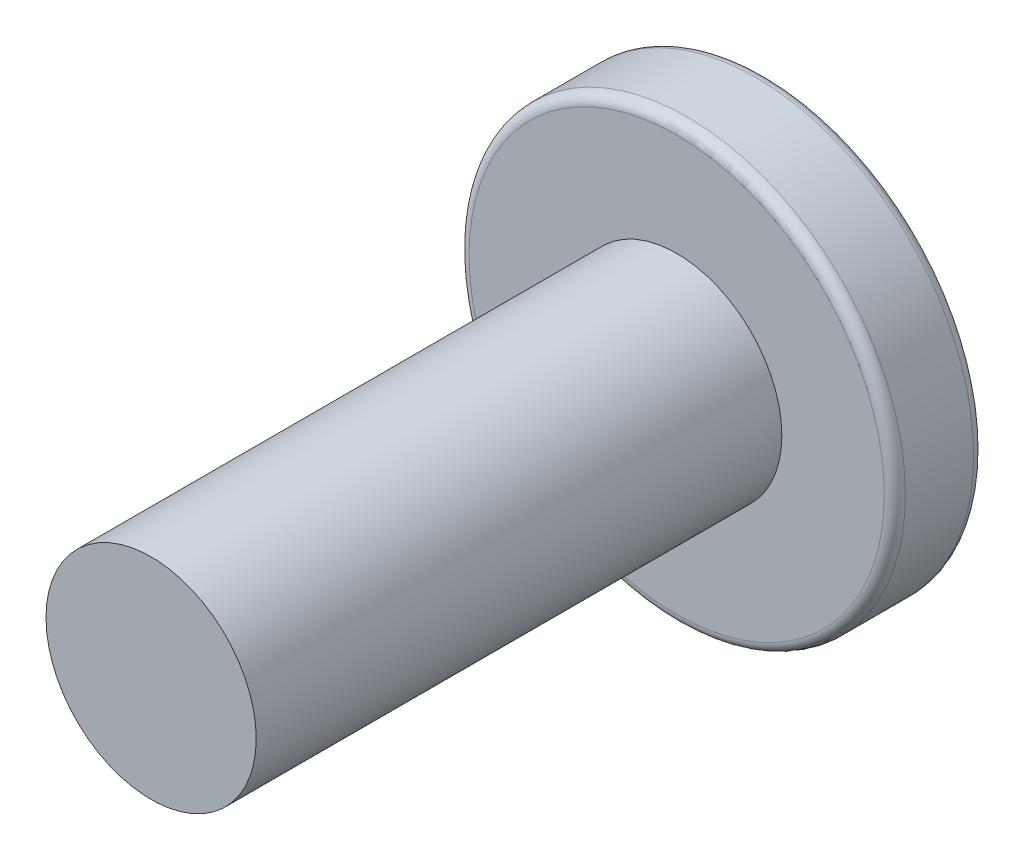
ISO-10303-21;
HEADER;
FILE_DESCRIPTION(('STEP AP214'),'2;1');
FILE_NAME('part.step','',(''),(''),'','','');
FILE_SCHEMA(('AUTOMOTIVE_DESIGN { 1 0 10303 214 1 1 1 1 }'));
ENDSEC;
DATA;
#1=APPLICATION_CONTEXT('core data for automotive mechanical design processes');
#2=APPLICATION_PROTOCOL_DEFINITION('international standard','automotive_design',2000,#1);
#3=PRODUCT_CONTEXT('',#1,'mechanical');
#4=PRODUCT('Part','Part','',(#3));
#5=PRODUCT_RELATED_PRODUCT_CATEGORY('part','',(#4));
#6=PRODUCT_DEFINITION_FORMATION('','',#4);
#7=PRODUCT_DEFINITION_CONTEXT('part definition',#1,'design');
#8=PRODUCT_DEFINITION('design','',#6,#7);
#9=PRODUCT_DEFINITION_SHAPE('','',#8);
#10=(LENGTH_UNIT() NAMED_UNIT(*) SI_UNIT(.MILLI.,.METRE.));
#11=(NAMED_UNIT(*) PLANE_ANGLE_UNIT() SI_UNIT($,.RADIAN.));
#12=(NAMED_UNIT(*) SI_UNIT($,.STERADIAN.) SOLID_ANGLE_UNIT());
#13=UNCERTAINTY_MEASURE_WITH_UNIT(LENGTH_MEASURE(1.E-05),#10,'distance_accuracy_value','');
#14=(GEOMETRIC_REPRESENTATION_CONTEXT(3) GLOBAL_UNCERTAINTY_ASSIGNED_CONTEXT((#13)) GLOBAL_UNIT_ASSIGNED_CONTEXT((#10,
#11,#12)) REPRESENTATION_CONTEXT('',''));
#15=CARTESIAN_POINT('',(0.,0.,0.));
#16=DIRECTION('',(0.,0.,1.));
#17=DIRECTION('',(1.,0.,0.));
#18=AXIS2_PLACEMENT_3D('',#15,#16,#17);
#19=CARTESIAN_POINT('',(0.,0.,1.7));
#20=DIRECTION('',(0.,0.,-1.));
#21=DIRECTION('',(-1.,0.,0.));
#22=AXIS2_PLACEMENT_3D('',#19,#20,#21);
#23=CYLINDRICAL_SURFACE('',#22,4.15);
#24=CARTESIAN_POINT('',(0.,0.,0.2));
#25=DIRECTION('',(0.,0.,1.));
#26=DIRECTION('',(1.,0.,0.));
#27=AXIS2_PLACEMENT_3D('',#24,#25,#26);
#28=CIRCLE('',#27,4.15);
#29=CARTESIAN_POINT('',(4.15,0.,0.2));
#30=VERTEX_POINT('',#29);
#31=EDGE_CURVE('E179',#30,#30,#28,.T.);
#32=ORIENTED_EDGE('',*,*,#31,.T.);
#33=EDGE_LOOP('',(#32));
#34=FACE_BOUND('',#33,.T.);
#35=CARTESIAN_POINT('',(0.,0.,1.5));
#36=DIRECTION('',(0.,0.,1.));
#37=DIRECTION('',(1.,0.,0.));
#38=AXIS2_PLACEMENT_3D('',#35,#36,#37);
#39=CIRCLE('',#38,4.15);
#40=CARTESIAN_POINT('',(4.15,0.,1.5));
#41=VERTEX_POINT('',#40);
#42=EDGE_CURVE('E175',#41,#41,#39,.F.);
#43=ORIENTED_EDGE('',*,*,#42,.T.);
#44=EDGE_LOOP('',(#43));
#45=FACE_BOUND('',#44,.T.);
#46=ADVANCED_FACE('F43',(#34,#45),#23,.T.);
#47=CARTESIAN_POINT('',(0.,0.,1.7));
#48=DIRECTION('',(0.,0.,1.));
#49=DIRECTION('',(1.,0.,0.));
#50=AXIS2_PLACEMENT_3D('',#47,#48,#49);
#51=PLANE('',#50);
#52=CARTESIAN_POINT('',(0.,0.,1.7));
#53=DIRECTION('',(0.,0.,1.));
#54=DIRECTION('',(1.,0.,0.));
#55=AXIS2_PLACEMENT_3D('',#52,#53,#54);
#56=CIRCLE('',#55,3.95);
#57=CARTESIAN_POINT('',(3.95,0.,1.7));
#58=VERTEX_POINT('',#57);
#59=EDGE_CURVE('E11',#58,#58,#56,.T.);
#60=ORIENTED_EDGE('',*,*,#59,.T.);
#61=EDGE_LOOP('',(#60));
#62=FACE_BOUND('',#61,.T.);
#63=CARTESIAN_POINT('',(0.,0.,1.7));
#64=DIRECTION('',(0.,0.,1.));
#65=DIRECTION('',(1.,0.,0.));
#66=AXIS2_PLACEMENT_3D('',#63,#64,#65);
#67=CIRCLE('',#66,2.);
#68=CARTESIAN_POINT('',(2.,0.,1.7));
#69=VERTEX_POINT('',#68);
#70=EDGE_CURVE('E171',#69,#69,#67,.T.);
#71=ORIENTED_EDGE('',*,*,#70,.F.);
#72=EDGE_LOOP('',(#71));
#73=FACE_BOUND('',#72,.T.);
#74=ADVANCED_FACE('F196',(#62,#73),#51,.T.);
#75=CARTESIAN_POINT('',(0.,0.,0.));
#76=DIRECTION('',(0.,0.,1.));
#77=DIRECTION('',(1.,0.,0.));
#78=AXIS2_PLACEMENT_3D('',#75,#76,#77);
#79=PLANE('',#78);
#80=DIRECTION('',(0.5,0.866025403784438,0.));
#81=VECTOR('',#80,1.);
#82=CARTESIAN_POINT('',(-1.15470053837925,0.,0.));
#83=LINE('',#82,#81);
#84=CARTESIAN_POINT('',(-1.15470053837925,0.,0.));
#85=VERTEX_POINT('',#84);
#86=CARTESIAN_POINT('',(-0.577350269189626,1.,0.));
#87=VERTEX_POINT('',#86);
#88=EDGE_CURVE('E139',#85,#87,#83,.T.);
#89=ORIENTED_EDGE('',*,*,#88,.F.);
#90=DIRECTION('',(-0.5,0.866025403784439,0.));
#91=VECTOR('',#90,1.);
#92=CARTESIAN_POINT('',(-0.577350269189626,-1.,0.));
#93=LINE('',#92,#91);
#94=CARTESIAN_POINT('',(-0.577350269189626,-1.,0.));
#95=VERTEX_POINT('',#94);
#96=EDGE_CURVE('E59',#95,#85,#93,.T.);
#97=ORIENTED_EDGE('',*,*,#96,.F.);
#98=DIRECTION('',(-1.,0.,0.));
#99=VECTOR('',#98,1.);
#100=CARTESIAN_POINT('',(0.577350269189626,-1.,0.));
#101=LINE('',#100,#99);
#102=CARTESIAN_POINT('',(0.577350269189626,-1.,0.));
#103=VERTEX_POINT('',#102);
#104=EDGE_CURVE('E152',#103,#95,#101,.T.);
#105=ORIENTED_EDGE('',*,*,#104,.F.);
#106=DIRECTION('',(-0.5,-0.866025403784438,0.));
#107=VECTOR('',#106,1.);
#108=CARTESIAN_POINT('',(1.15470053837925,0.,0.));
#109=LINE('',#108,#107);
#110=CARTESIAN_POINT('',(1.15470053837925,0.,0.));
#111=VERTEX_POINT('',#110);
#112=EDGE_CURVE('E149',#111,#103,#109,.T.);
#113=ORIENTED_EDGE('',*,*,#112,.F.);
#114=DIRECTION('',(0.5,-0.866025403784439,0.));
#115=VECTOR('',#114,1.);
#116=CARTESIAN_POINT('',(0.577350269189626,1.,0.));
#117=LINE('',#116,#115);
#118=CARTESIAN_POINT('',(0.577350269189626,1.,0.));
#119=VERTEX_POINT('',#118);
#120=EDGE_CURVE('E107',#119,#111,#117,.T.);
#121=ORIENTED_EDGE('',*,*,#120,.F.);
#122=DIRECTION('',(1.,0.,0.));
#123=VECTOR('',#122,1.);
#124=CARTESIAN_POINT('',(-0.577350269189626,1.,0.));
#125=LINE('',#124,#123);
#126=EDGE_CURVE('E143',#87,#119,#125,.T.);
#127=ORIENTED_EDGE('',*,*,#126,.F.);
#128=EDGE_LOOP('',(#89,#97,#105,#113,#121,#127));
#129=FACE_BOUND('',#128,.T.);
#130=CARTESIAN_POINT('',(0.,0.,0.));
#131=DIRECTION('',(0.,0.,1.));
#132=DIRECTION('',(1.,0.,0.));
#133=AXIS2_PLACEMENT_3D('',#130,#131,#132);
#134=CIRCLE('',#133,3.95);
#135=CARTESIAN_POINT('',(3.95,0.,0.));
#136=VERTEX_POINT('',#135);
#137=EDGE_CURVE('E52',#136,#136,#134,.F.);
#138=ORIENTED_EDGE('',*,*,#137,.T.);
#139=EDGE_LOOP('',(#138));
#140=FACE_BOUND('',#139,.T.);
#141=ADVANCED_FACE('F186',(#129,#140),#79,.F.);
#142=CARTESIAN_POINT('',(0.,0.,11.7));
#143=DIRECTION('',(0.,0.,-1.));
#144=DIRECTION('',(-1.,0.,0.));
#145=AXIS2_PLACEMENT_3D('',#142,#143,#144);
#146=CYLINDRICAL_SURFACE('',#145,2.);
#147=CARTESIAN_POINT('',(0.,0.,11.7));
#148=DIRECTION('',(0.,0.,1.));
#149=DIRECTION('',(1.,0.,0.));
#150=AXIS2_PLACEMENT_3D('',#147,#148,#149);
#151=CIRCLE('',#150,2.);
#152=CARTESIAN_POINT('',(2.,0.,11.7));
#153=VERTEX_POINT('',#152);
#154=EDGE_CURVE('E158',#153,#153,#151,.T.);
#155=ORIENTED_EDGE('',*,*,#154,.F.);
#156=EDGE_LOOP('',(#155));
#157=FACE_BOUND('',#156,.T.);
#158=ORIENTED_EDGE('',*,*,#70,.T.);
#159=EDGE_LOOP('',(#158));
#160=FACE_BOUND('',#159,.T.);
#161=ADVANCED_FACE('F210',(#157,#160),#146,.T.);
#162=CARTESIAN_POINT('',(0.,0.,11.7));
#163=DIRECTION('',(0.,0.,1.));
#164=DIRECTION('',(1.,0.,0.));
#165=AXIS2_PLACEMENT_3D('',#162,#163,#164);
#166=PLANE('',#165);
#167=ORIENTED_EDGE('',*,*,#154,.T.);
#168=EDGE_LOOP('',(#167));
#169=FACE_BOUND('',#168,.T.);
#170=ADVANCED_FACE('F191',(#169),#166,.T.);
#171=CARTESIAN_POINT('',(0.,0.,0.2));
#172=DIRECTION('',(0.,0.,1.));
#173=DIRECTION('',(1.,0.,0.));
#174=AXIS2_PLACEMENT_3D('',#171,#172,#173);
#175=TOROIDAL_SURFACE('',#174,3.95,0.2);
#176=ORIENTED_EDGE('',*,*,#137,.F.);
#177=EDGE_LOOP('',(#176));
#178=FACE_BOUND('',#177,.T.);
#179=ORIENTED_EDGE('',*,*,#31,.F.);
#180=EDGE_LOOP('',(#179));
#181=FACE_BOUND('',#180,.T.);
#182=ADVANCED_FACE('F188',(#178,#181),#175,.T.);
#183=CARTESIAN_POINT('',(0.,0.,1.5));
#184=DIRECTION('',(0.,0.,1.));
#185=DIRECTION('',(1.,0.,0.));
#186=AXIS2_PLACEMENT_3D('',#183,#184,#185);
#187=TOROIDAL_SURFACE('',#186,3.95,0.2);
#188=ORIENTED_EDGE('',*,*,#42,.F.);
#189=EDGE_LOOP('',(#188));
#190=FACE_BOUND('',#189,.T.);
#191=ORIENTED_EDGE('',*,*,#59,.F.);
#192=EDGE_LOOP('',(#191));
#193=FACE_BOUND('',#192,.T.);
#194=ADVANCED_FACE('F45',(#190,#193),#187,.T.);
#195=CARTESIAN_POINT('',(-0.577350269189626,-1.,1.5));
#196=DIRECTION('',(-0.866025403784439,-0.5,0.));
#197=DIRECTION('',(0.5,-0.866025403784439,0.));
#198=AXIS2_PLACEMENT_3D('',#195,#196,#197);
#199=PLANE('',#198);
#200=ORIENTED_EDGE('',*,*,#96,.T.);
#201=DIRECTION('',(0.,0.,-1.));
#202=VECTOR('',#201,1.);
#203=CARTESIAN_POINT('',(-1.15470053837925,0.,1.5));
#204=LINE('',#203,#202);
#205=CARTESIAN_POINT('',(-1.15470053837925,0.,1.5));
#206=VERTEX_POINT('',#205);
#207=EDGE_CURVE('E89',#206,#85,#204,.T.);
#208=ORIENTED_EDGE('',*,*,#207,.F.);
#209=DIRECTION('',(-0.5,0.866025403784439,0.));
#210=VECTOR('',#209,1.);
#211=CARTESIAN_POINT('',(-0.577350269189626,-1.,1.5));
#212=LINE('',#211,#210);
#213=CARTESIAN_POINT('',(-0.577350269189626,-1.,1.5));
#214=VERTEX_POINT('',#213);
#215=EDGE_CURVE('E155',#214,#206,#212,.T.);
#216=ORIENTED_EDGE('',*,*,#215,.F.);
#217=DIRECTION('',(0.,0.,-1.));
#218=VECTOR('',#217,1.);
#219=CARTESIAN_POINT('',(-0.577350269189626,-1.,1.5));
#220=LINE('',#219,#218);
#221=EDGE_CURVE('E67',#214,#95,#220,.T.);
#222=ORIENTED_EDGE('',*,*,#221,.T.);
#223=EDGE_LOOP('',(#200,#208,#216,#222));
#224=FACE_BOUND('',#223,.T.);
#225=ADVANCED_FACE('F202',(#224),#199,.F.);
#226=CARTESIAN_POINT('',(0.577350269189626,-1.,1.5));
#227=DIRECTION('',(0.,-1.,0.));
#228=DIRECTION('',(0.,0.,-1.));
#229=AXIS2_PLACEMENT_3D('',#226,#227,#228);
#230=PLANE('',#229);
#231=ORIENTED_EDGE('',*,*,#104,.T.);
#232=ORIENTED_EDGE('',*,*,#221,.F.);
#233=DIRECTION('',(-1.,0.,0.));
#234=VECTOR('',#233,1.);
#235=CARTESIAN_POINT('',(0.577350269189626,-1.,1.5));
#236=LINE('',#235,#234);
#237=CARTESIAN_POINT('',(0.577350269189626,-1.,1.5));
#238=VERTEX_POINT('',#237);
#239=EDGE_CURVE('E121',#238,#214,#236,.T.);
#240=ORIENTED_EDGE('',*,*,#239,.F.);
#241=DIRECTION('',(0.,0.,-1.));
#242=VECTOR('',#241,1.);
#243=CARTESIAN_POINT('',(0.577350269189626,-1.,1.5));
#244=LINE('',#243,#242);
#245=EDGE_CURVE('E112',#238,#103,#244,.T.);
#246=ORIENTED_EDGE('',*,*,#245,.T.);
#247=EDGE_LOOP('',(#231,#232,#240,#246));
#248=FACE_BOUND('',#247,.T.);
#249=ADVANCED_FACE('F226',(#248),#230,.F.);
#250=CARTESIAN_POINT('',(1.15470053837925,0.,1.5));
#251=DIRECTION('',(0.866025403784439,-0.5,0.));
#252=DIRECTION('',(0.5,0.866025403784439,0.));
#253=AXIS2_PLACEMENT_3D('',#250,#251,#252);
#254=PLANE('',#253);
#255=ORIENTED_EDGE('',*,*,#112,.T.);
#256=ORIENTED_EDGE('',*,*,#245,.F.);
#257=DIRECTION('',(-0.5,-0.866025403784438,0.));
#258=VECTOR('',#257,1.);
#259=CARTESIAN_POINT('',(1.15470053837925,0.,1.5));
#260=LINE('',#259,#258);
#261=CARTESIAN_POINT('',(1.15470053837925,0.,1.5));
#262=VERTEX_POINT('',#261);
#263=EDGE_CURVE('E116',#262,#238,#260,.T.);
#264=ORIENTED_EDGE('',*,*,#263,.F.);
#265=DIRECTION('',(0.,0.,-1.));
#266=VECTOR('',#265,1.);
#267=CARTESIAN_POINT('',(1.15470053837925,0.,1.5));
#268=LINE('',#267,#266);
#269=EDGE_CURVE('E100',#262,#111,#268,.T.);
#270=ORIENTED_EDGE('',*,*,#269,.T.);
#271=EDGE_LOOP('',(#255,#256,#264,#270));
#272=FACE_BOUND('',#271,.T.);
#273=ADVANCED_FACE('F117',(#272),#254,.F.);
#274=CARTESIAN_POINT('',(0.577350269189626,1.,1.5));
#275=DIRECTION('',(0.866025403784439,0.5,0.));
#276=DIRECTION('',(-0.5,0.866025403784439,0.));
#277=AXIS2_PLACEMENT_3D('',#274,#275,#276);
#278=PLANE('',#277);
#279=ORIENTED_EDGE('',*,*,#120,.T.);
#280=ORIENTED_EDGE('',*,*,#269,.F.);
#281=DIRECTION('',(0.5,-0.866025403784439,0.));
#282=VECTOR('',#281,1.);
#283=CARTESIAN_POINT('',(0.577350269189626,1.,1.5));
#284=LINE('',#283,#282);
#285=CARTESIAN_POINT('',(0.577350269189626,1.,1.5));
#286=VERTEX_POINT('',#285);
#287=EDGE_CURVE('E104',#286,#262,#284,.T.);
#288=ORIENTED_EDGE('',*,*,#287,.F.);
#289=DIRECTION('',(0.,0.,-1.));
#290=VECTOR('',#289,1.);
#291=CARTESIAN_POINT('',(0.577350269189626,1.,1.5));
#292=LINE('',#291,#290);
#293=EDGE_CURVE('E113',#286,#119,#292,.T.);
#294=ORIENTED_EDGE('',*,*,#293,.T.);
#295=EDGE_LOOP('',(#279,#280,#288,#294));
#296=FACE_BOUND('',#295,.T.);
#297=ADVANCED_FACE('F102',(#296),#278,.F.);
#298=CARTESIAN_POINT('',(-0.577350269189626,1.,1.5));
#299=DIRECTION('',(0.,1.,0.));
#300=DIRECTION('',(0.,0.,1.));
#301=AXIS2_PLACEMENT_3D('',#298,#299,#300);
#302=PLANE('',#301);
#303=ORIENTED_EDGE('',*,*,#126,.T.);
#304=ORIENTED_EDGE('',*,*,#293,.F.);
#305=DIRECTION('',(1.,0.,0.));
#306=VECTOR('',#305,1.);
#307=CARTESIAN_POINT('',(-0.577350269189626,1.,1.5));
#308=LINE('',#307,#306);
#309=CARTESIAN_POINT('',(-0.577350269189626,1.,1.5));
#310=VERTEX_POINT('',#309);
#311=EDGE_CURVE('E127',#310,#286,#308,.T.);
#312=ORIENTED_EDGE('',*,*,#311,.F.);
#313=DIRECTION('',(0.,0.,-1.));
#314=VECTOR('',#313,1.);
#315=CARTESIAN_POINT('',(-0.577350269189626,1.,1.5));
#316=LINE('',#315,#314);
#317=EDGE_CURVE('E163',#310,#87,#316,.T.);
#318=ORIENTED_EDGE('',*,*,#317,.T.);
#319=EDGE_LOOP('',(#303,#304,#312,#318));
#320=FACE_BOUND('',#319,.T.);
#321=ADVANCED_FACE('F230',(#320),#302,.F.);
#322=CARTESIAN_POINT('',(-1.15470053837925,0.,1.5));
#323=DIRECTION('',(-0.866025403784439,0.5,0.));
#324=DIRECTION('',(-0.5,-0.866025403784439,0.));
#325=AXIS2_PLACEMENT_3D('',#322,#323,#324);
#326=PLANE('',#325);
#327=ORIENTED_EDGE('',*,*,#88,.T.);
#328=ORIENTED_EDGE('',*,*,#317,.F.);
#329=DIRECTION('',(0.5,0.866025403784438,0.));
#330=VECTOR('',#329,1.);
#331=CARTESIAN_POINT('',(-1.15470053837925,0.,1.5));
#332=LINE('',#331,#330);
#333=EDGE_CURVE('E131',#206,#310,#332,.T.);
#334=ORIENTED_EDGE('',*,*,#333,.F.);
#335=ORIENTED_EDGE('',*,*,#207,.T.);
#336=EDGE_LOOP('',(#327,#328,#334,#335));
#337=FACE_BOUND('',#336,.T.);
#338=ADVANCED_FACE('F227',(#337),#326,.F.);
#339=CARTESIAN_POINT('',(0.,0.,1.5));
#340=DIRECTION('',(0.,0.,-1.));
#341=DIRECTION('',(-1.,0.,0.));
#342=AXIS2_PLACEMENT_3D('',#339,#340,#341);
#343=PLANE('',#342);
#344=ORIENTED_EDGE('',*,*,#215,.T.);
#345=ORIENTED_EDGE('',*,*,#333,.T.);
#346=ORIENTED_EDGE('',*,*,#311,.T.);
#347=ORIENTED_EDGE('',*,*,#287,.T.);
#348=ORIENTED_EDGE('',*,*,#263,.T.);
#349=ORIENTED_EDGE('',*,*,#239,.T.);
#350=EDGE_LOOP('',(#344,#345,#346,#347,#348,#349));
#351=FACE_BOUND('',#350,.T.);
#352=ADVANCED_FACE('F124',(#351),#343,.T.);
#353=CLOSED_SHELL('',(#46,#74,#141,#161,#170,#182,#194,#225,#249,#273,#297,#321,#338,#352));
#354=MANIFOLD_SOLID_BREP('B2',#353);
#355=ADVANCED_BREP_SHAPE_REPRESENTATION('',(#18,#354),#14);
#356=SHAPE_DEFINITION_REPRESENTATION(#9,#355);
ENDSEC;
END-ISO-10303-21;
